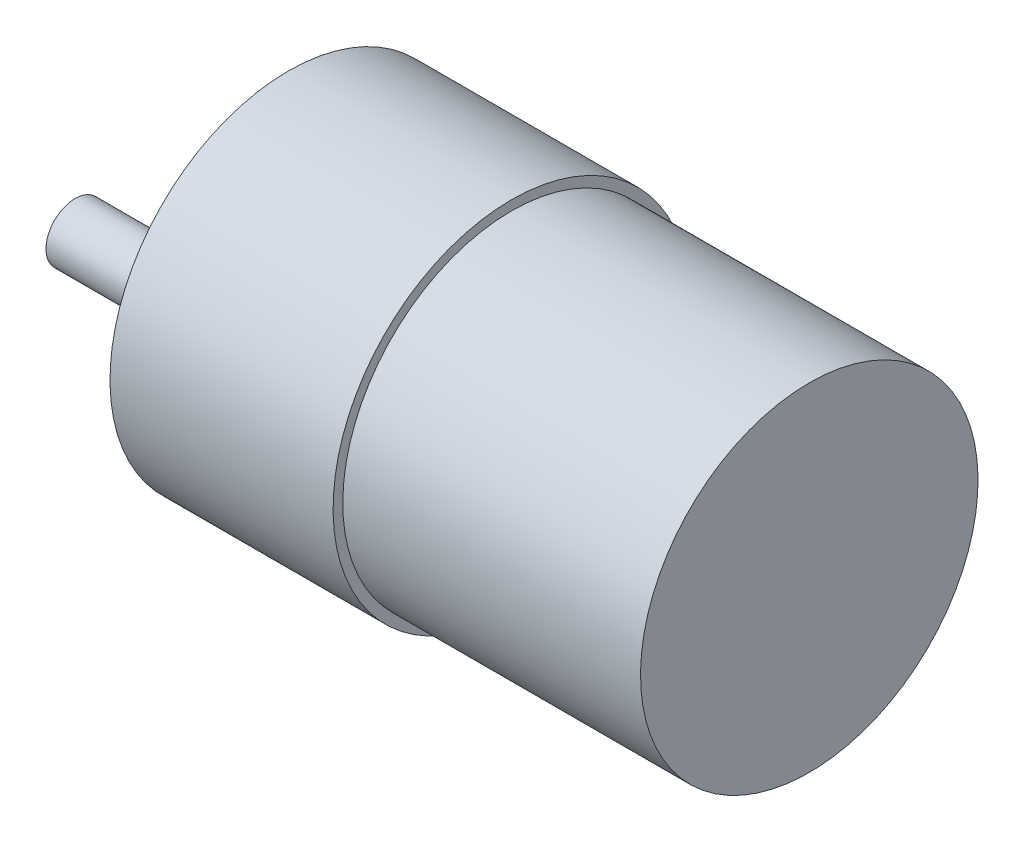
ISO-10303-21;
HEADER;
FILE_DESCRIPTION(('STEP AP214'),'2;1');
FILE_NAME('part.step','',(''),(''),'','','');
FILE_SCHEMA(('AUTOMOTIVE_DESIGN { 1 0 10303 214 1 1 1 1 }'));
ENDSEC;
DATA;
#1=APPLICATION_CONTEXT('core data for automotive mechanical design processes');
#2=APPLICATION_PROTOCOL_DEFINITION('international standard','automotive_design',2000,#1);
#3=PRODUCT_CONTEXT('',#1,'mechanical');
#4=PRODUCT('Part','Part','',(#3));
#5=PRODUCT_RELATED_PRODUCT_CATEGORY('part','',(#4));
#6=PRODUCT_DEFINITION_FORMATION('','',#4);
#7=PRODUCT_DEFINITION_CONTEXT('part definition',#1,'design');
#8=PRODUCT_DEFINITION('design','',#6,#7);
#9=PRODUCT_DEFINITION_SHAPE('','',#8);
#10=(LENGTH_UNIT() NAMED_UNIT(*) SI_UNIT(.MILLI.,.METRE.));
#11=(NAMED_UNIT(*) PLANE_ANGLE_UNIT() SI_UNIT($,.RADIAN.));
#12=(NAMED_UNIT(*) SI_UNIT($,.STERADIAN.) SOLID_ANGLE_UNIT());
#13=UNCERTAINTY_MEASURE_WITH_UNIT(LENGTH_MEASURE(1.E-05),#10,'distance_accuracy_value','');
#14=(GEOMETRIC_REPRESENTATION_CONTEXT(3) GLOBAL_UNCERTAINTY_ASSIGNED_CONTEXT((#13)) GLOBAL_UNIT_ASSIGNED_CONTEXT((#10,
#11,#12)) REPRESENTATION_CONTEXT('',''));
#15=CARTESIAN_POINT('',(0.,0.,0.));
#16=DIRECTION('',(0.,0.,1.));
#17=DIRECTION('',(1.,0.,0.));
#18=AXIS2_PLACEMENT_3D('',#15,#16,#17);
#19=CARTESIAN_POINT('',(0.,0.,0.));
#20=DIRECTION('',(-1.,0.,0.));
#21=DIRECTION('',(0.,-1.,0.));
#22=AXIS2_PLACEMENT_3D('',#19,#20,#21);
#23=PLANE('',#22);
#24=CARTESIAN_POINT('',(0.,0.,15.5));
#25=DIRECTION('',(-1.,0.,0.));
#26=DIRECTION('',(0.,-1.,0.));
#27=AXIS2_PLACEMENT_3D('',#24,#25,#26);
#28=CIRCLE('',#27,1.5);
#29=CARTESIAN_POINT('',(0.,-1.5,15.5));
#30=VERTEX_POINT('',#29);
#31=EDGE_CURVE('E112',#30,#30,#28,.T.);
#32=ORIENTED_EDGE('',*,*,#31,.F.);
#33=EDGE_LOOP('',(#32));
#34=FACE_BOUND('',#33,.T.);
#35=CARTESIAN_POINT('',(0.,13.4233937586588,7.75));
#36=DIRECTION('',(-1.,0.,0.));
#37=DIRECTION('',(0.,-1.,0.));
#38=AXIS2_PLACEMENT_3D('',#35,#36,#37);
#39=CIRCLE('',#38,1.5);
#40=CARTESIAN_POINT('',(0.,11.9233937586588,7.75));
#41=VERTEX_POINT('',#40);
#42=EDGE_CURVE('E84',#41,#41,#39,.T.);
#43=ORIENTED_EDGE('',*,*,#42,.F.);
#44=EDGE_LOOP('',(#43));
#45=FACE_BOUND('',#44,.T.);
#46=CARTESIAN_POINT('',(0.,13.4233937586588,-7.75000000000001));
#47=DIRECTION('',(-1.,0.,0.));
#48=DIRECTION('',(0.,-1.,0.));
#49=AXIS2_PLACEMENT_3D('',#46,#47,#48);
#50=CIRCLE('',#49,1.5);
#51=CARTESIAN_POINT('',(0.,11.9233937586588,-7.75000000000001));
#52=VERTEX_POINT('',#51);
#53=EDGE_CURVE('E83',#52,#52,#50,.T.);
#54=ORIENTED_EDGE('',*,*,#53,.F.);
#55=EDGE_LOOP('',(#54));
#56=FACE_BOUND('',#55,.T.);
#57=CARTESIAN_POINT('',(0.,0.,-15.5));
#58=DIRECTION('',(-1.,0.,0.));
#59=DIRECTION('',(0.,-1.,0.));
#60=AXIS2_PLACEMENT_3D('',#57,#58,#59);
#61=CIRCLE('',#60,1.5);
#62=CARTESIAN_POINT('',(0.,-1.5,-15.5));
#63=VERTEX_POINT('',#62);
#64=EDGE_CURVE('E92',#63,#63,#61,.T.);
#65=ORIENTED_EDGE('',*,*,#64,.F.);
#66=EDGE_LOOP('',(#65));
#67=FACE_BOUND('',#66,.T.);
#68=CARTESIAN_POINT('',(0.,-13.4233937586588,-7.75));
#69=DIRECTION('',(-1.,0.,0.));
#70=DIRECTION('',(0.,-1.,0.));
#71=AXIS2_PLACEMENT_3D('',#68,#69,#70);
#72=CIRCLE('',#71,1.5);
#73=CARTESIAN_POINT('',(0.,-14.9233937586588,-7.75));
#74=VERTEX_POINT('',#73);
#75=EDGE_CURVE('E100',#74,#74,#72,.T.);
#76=ORIENTED_EDGE('',*,*,#75,.F.);
#77=EDGE_LOOP('',(#76));
#78=FACE_BOUND('',#77,.T.);
#79=CARTESIAN_POINT('',(0.,-13.4233937586588,7.75));
#80=DIRECTION('',(-1.,0.,0.));
#81=DIRECTION('',(0.,-1.,0.));
#82=AXIS2_PLACEMENT_3D('',#79,#80,#81);
#83=CIRCLE('',#82,1.5);
#84=CARTESIAN_POINT('',(0.,-14.9233937586588,7.75));
#85=VERTEX_POINT('',#84);
#86=EDGE_CURVE('E108',#85,#85,#83,.T.);
#87=ORIENTED_EDGE('',*,*,#86,.F.);
#88=EDGE_LOOP('',(#87));
#89=FACE_BOUND('',#88,.T.);
#90=CARTESIAN_POINT('',(0.,-7.,0.));
#91=DIRECTION('',(-1.,0.,0.));
#92=DIRECTION('',(0.,-1.,0.));
#93=AXIS2_PLACEMENT_3D('',#90,#91,#92);
#94=CIRCLE('',#93,6.);
#95=CARTESIAN_POINT('',(0.,-13.,0.));
#96=VERTEX_POINT('',#95);
#97=EDGE_CURVE('E70',#96,#96,#94,.T.);
#98=ORIENTED_EDGE('',*,*,#97,.F.);
#99=EDGE_LOOP('',(#98));
#100=FACE_BOUND('',#99,.T.);
#101=CARTESIAN_POINT('',(0.,0.,0.));
#102=DIRECTION('',(1.,0.,0.));
#103=DIRECTION('',(0.,1.,0.));
#104=AXIS2_PLACEMENT_3D('',#101,#102,#103);
#105=CIRCLE('',#104,18.4);
#106=CARTESIAN_POINT('',(0.,18.4,0.));
#107=VERTEX_POINT('',#106);
#108=EDGE_CURVE('E10',#107,#107,#105,.T.);
#109=ORIENTED_EDGE('',*,*,#108,.F.);
#110=EDGE_LOOP('',(#109));
#111=FACE_BOUND('',#110,.T.);
#112=ADVANCED_FACE('F43',(#34,#45,#56,#67,#78,#89,#100,#111),#23,.T.);
#113=CARTESIAN_POINT('',(53.7,0.,0.));
#114=DIRECTION('',(1.,0.,0.));
#115=DIRECTION('',(0.,1.,0.));
#116=AXIS2_PLACEMENT_3D('',#113,#114,#115);
#117=CYLINDRICAL_SURFACE('',#116,18.4);
#118=ORIENTED_EDGE('',*,*,#108,.T.);
#119=EDGE_LOOP('',(#118));
#120=FACE_BOUND('',#119,.T.);
#121=CARTESIAN_POINT('',(23.,0.,0.));
#122=DIRECTION('',(1.,0.,0.));
#123=DIRECTION('',(0.,1.,0.));
#124=AXIS2_PLACEMENT_3D('',#121,#122,#123);
#125=CIRCLE('',#124,18.4);
#126=CARTESIAN_POINT('',(23.,18.4,0.));
#127=VERTEX_POINT('',#126);
#128=EDGE_CURVE('E51',#127,#127,#125,.T.);
#129=ORIENTED_EDGE('',*,*,#128,.F.);
#130=EDGE_LOOP('',(#129));
#131=FACE_BOUND('',#130,.T.);
#132=ADVANCED_FACE('F138',(#120,#131),#117,.T.);
#133=CARTESIAN_POINT('',(23.,18.4,0.));
#134=DIRECTION('',(1.,0.,0.));
#135=DIRECTION('',(0.,1.,0.));
#136=AXIS2_PLACEMENT_3D('',#133,#134,#135);
#137=PLANE('',#136);
#138=ORIENTED_EDGE('',*,*,#128,.T.);
#139=EDGE_LOOP('',(#138));
#140=FACE_BOUND('',#139,.T.);
#141=CARTESIAN_POINT('',(23.,0.,0.));
#142=DIRECTION('',(1.,0.,0.));
#143=DIRECTION('',(0.,1.,0.));
#144=AXIS2_PLACEMENT_3D('',#141,#142,#143);
#145=CIRCLE('',#144,17.4);
#146=CARTESIAN_POINT('',(23.,17.4,0.));
#147=VERTEX_POINT('',#146);
#148=EDGE_CURVE('E56',#147,#147,#145,.T.);
#149=ORIENTED_EDGE('',*,*,#148,.F.);
#150=EDGE_LOOP('',(#149));
#151=FACE_BOUND('',#150,.T.);
#152=ADVANCED_FACE('F181',(#140,#151),#137,.T.);
#153=CARTESIAN_POINT('',(53.7,0.,0.));
#154=DIRECTION('',(1.,0.,0.));
#155=DIRECTION('',(0.,1.,0.));
#156=AXIS2_PLACEMENT_3D('',#153,#154,#155);
#157=CYLINDRICAL_SURFACE('',#156,17.4);
#158=ORIENTED_EDGE('',*,*,#148,.T.);
#159=EDGE_LOOP('',(#158));
#160=FACE_BOUND('',#159,.T.);
#161=CARTESIAN_POINT('',(53.7,0.,0.));
#162=DIRECTION('',(1.,0.,0.));
#163=DIRECTION('',(0.,1.,0.));
#164=AXIS2_PLACEMENT_3D('',#161,#162,#163);
#165=CIRCLE('',#164,17.4);
#166=CARTESIAN_POINT('',(53.7,17.4,0.));
#167=VERTEX_POINT('',#166);
#168=EDGE_CURVE('E62',#167,#167,#165,.T.);
#169=ORIENTED_EDGE('',*,*,#168,.F.);
#170=EDGE_LOOP('',(#169));
#171=FACE_BOUND('',#170,.T.);
#172=ADVANCED_FACE('F166',(#160,#171),#157,.T.);
#173=CARTESIAN_POINT('',(53.7,17.4,0.));
#174=DIRECTION('',(1.,0.,0.));
#175=DIRECTION('',(0.,1.,0.));
#176=AXIS2_PLACEMENT_3D('',#173,#174,#175);
#177=PLANE('',#176);
#178=ORIENTED_EDGE('',*,*,#168,.T.);
#179=EDGE_LOOP('',(#178));
#180=FACE_BOUND('',#179,.T.);
#181=ADVANCED_FACE('F155',(#180),#177,.T.);
#182=CARTESIAN_POINT('',(-6.,-7.,0.));
#183=DIRECTION('',(1.,0.,0.));
#184=DIRECTION('',(0.,1.,0.));
#185=AXIS2_PLACEMENT_3D('',#182,#183,#184);
#186=CYLINDRICAL_SURFACE('',#185,6.);
#187=CARTESIAN_POINT('',(-6.,-7.,0.));
#188=DIRECTION('',(-1.,0.,0.));
#189=DIRECTION('',(0.,-1.,0.));
#190=AXIS2_PLACEMENT_3D('',#187,#188,#189);
#191=CIRCLE('',#190,6.);
#192=CARTESIAN_POINT('',(-6.,-13.,0.));
#193=VERTEX_POINT('',#192);
#194=EDGE_CURVE('E74',#193,#193,#191,.T.);
#195=ORIENTED_EDGE('',*,*,#194,.F.);
#196=EDGE_LOOP('',(#195));
#197=FACE_BOUND('',#196,.T.);
#198=ORIENTED_EDGE('',*,*,#97,.T.);
#199=EDGE_LOOP('',(#198));
#200=FACE_BOUND('',#199,.T.);
#201=ADVANCED_FACE('F152',(#197,#200),#186,.T.);
#202=CARTESIAN_POINT('',(-6.,-7.,0.));
#203=DIRECTION('',(-1.,0.,0.));
#204=DIRECTION('',(0.,-1.,0.));
#205=AXIS2_PLACEMENT_3D('',#202,#203,#204);
#206=PLANE('',#205);
#207=CARTESIAN_POINT('',(-6.,-7.,0.));
#208=DIRECTION('',(-1.,0.,0.));
#209=DIRECTION('',(0.,-1.,0.));
#210=AXIS2_PLACEMENT_3D('',#207,#208,#209);
#211=CIRCLE('',#210,3.);
#212=CARTESIAN_POINT('',(-6.,-10.,0.));
#213=VERTEX_POINT('',#212);
#214=EDGE_CURVE('E46',#213,#213,#211,.T.);
#215=ORIENTED_EDGE('',*,*,#214,.F.);
#216=EDGE_LOOP('',(#215));
#217=FACE_BOUND('',#216,.T.);
#218=ORIENTED_EDGE('',*,*,#194,.T.);
#219=EDGE_LOOP('',(#218));
#220=FACE_BOUND('',#219,.T.);
#221=ADVANCED_FACE('F154',(#217,#220),#206,.T.);
#222=CARTESIAN_POINT('',(-22.,-7.,0.));
#223=DIRECTION('',(-1.,0.,0.));
#224=DIRECTION('',(0.,-1.,0.));
#225=AXIS2_PLACEMENT_3D('',#222,#223,#224);
#226=PLANE('',#225);
#227=CARTESIAN_POINT('',(-22.,-7.,0.));
#228=DIRECTION('',(-1.,0.,0.));
#229=DIRECTION('',(0.,-1.,0.));
#230=AXIS2_PLACEMENT_3D('',#227,#228,#229);
#231=CIRCLE('',#230,3.);
#232=CARTESIAN_POINT('',(-22.,-10.,0.));
#233=VERTEX_POINT('',#232);
#234=EDGE_CURVE('E66',#233,#233,#231,.T.);
#235=ORIENTED_EDGE('',*,*,#234,.T.);
#236=EDGE_LOOP('',(#235));
#237=FACE_BOUND('',#236,.T.);
#238=ADVANCED_FACE('F162',(#237),#226,.T.);
#239=CARTESIAN_POINT('',(-22.,-7.,0.));
#240=DIRECTION('',(1.,0.,0.));
#241=DIRECTION('',(0.,1.,0.));
#242=AXIS2_PLACEMENT_3D('',#239,#240,#241);
#243=CYLINDRICAL_SURFACE('',#242,3.);
#244=ORIENTED_EDGE('',*,*,#214,.T.);
#245=EDGE_LOOP('',(#244));
#246=FACE_BOUND('',#245,.T.);
#247=ORIENTED_EDGE('',*,*,#234,.F.);
#248=EDGE_LOOP('',(#247));
#249=FACE_BOUND('',#248,.T.);
#250=ADVANCED_FACE('F173',(#246,#249),#243,.T.);
#251=CARTESIAN_POINT('',(6.,-13.4233937586588,7.75));
#252=DIRECTION('',(-1.,0.,0.));
#253=DIRECTION('',(0.,-1.,0.));
#254=AXIS2_PLACEMENT_3D('',#251,#252,#253);
#255=CYLINDRICAL_SURFACE('',#254,1.5);
#256=CARTESIAN_POINT('',(6.,-13.4233937586588,7.75));
#257=DIRECTION('',(-1.,0.,0.));
#258=DIRECTION('',(0.,-1.,0.));
#259=AXIS2_PLACEMENT_3D('',#256,#257,#258);
#260=CIRCLE('',#259,1.5);
#261=CARTESIAN_POINT('',(6.,-14.9233937586588,7.75));
#262=VERTEX_POINT('',#261);
#263=EDGE_CURVE('E104',#262,#262,#260,.T.);
#264=ORIENTED_EDGE('',*,*,#263,.F.);
#265=EDGE_LOOP('',(#264));
#266=FACE_BOUND('',#265,.T.);
#267=ORIENTED_EDGE('',*,*,#86,.T.);
#268=EDGE_LOOP('',(#267));
#269=FACE_BOUND('',#268,.T.);
#270=ADVANCED_FACE('F176',(#266,#269),#255,.F.);
#271=CARTESIAN_POINT('',(6.,-13.4233937586588,7.75));
#272=DIRECTION('',(-1.,0.,0.));
#273=DIRECTION('',(0.,-1.,0.));
#274=AXIS2_PLACEMENT_3D('',#271,#272,#273);
#275=PLANE('',#274);
#276=ORIENTED_EDGE('',*,*,#263,.T.);
#277=EDGE_LOOP('',(#276));
#278=FACE_BOUND('',#277,.T.);
#279=ADVANCED_FACE('F239',(#278),#275,.T.);
#280=CARTESIAN_POINT('',(6.,-13.4233937586588,-7.75));
#281=DIRECTION('',(-1.,0.,0.));
#282=DIRECTION('',(0.,-1.,0.));
#283=AXIS2_PLACEMENT_3D('',#280,#281,#282);
#284=CYLINDRICAL_SURFACE('',#283,1.5);
#285=CARTESIAN_POINT('',(6.,-13.4233937586588,-7.75));
#286=DIRECTION('',(-1.,0.,0.));
#287=DIRECTION('',(0.,-1.,0.));
#288=AXIS2_PLACEMENT_3D('',#285,#286,#287);
#289=CIRCLE('',#288,1.5);
#290=CARTESIAN_POINT('',(6.,-14.9233937586588,-7.75));
#291=VERTEX_POINT('',#290);
#292=EDGE_CURVE('E96',#291,#291,#289,.T.);
#293=ORIENTED_EDGE('',*,*,#292,.F.);
#294=EDGE_LOOP('',(#293));
#295=FACE_BOUND('',#294,.T.);
#296=ORIENTED_EDGE('',*,*,#75,.T.);
#297=EDGE_LOOP('',(#296));
#298=FACE_BOUND('',#297,.T.);
#299=ADVANCED_FACE('F249',(#295,#298),#284,.F.);
#300=CARTESIAN_POINT('',(6.,-13.4233937586588,-7.75));
#301=DIRECTION('',(-1.,0.,0.));
#302=DIRECTION('',(0.,-1.,0.));
#303=AXIS2_PLACEMENT_3D('',#300,#301,#302);
#304=PLANE('',#303);
#305=ORIENTED_EDGE('',*,*,#292,.T.);
#306=EDGE_LOOP('',(#305));
#307=FACE_BOUND('',#306,.T.);
#308=ADVANCED_FACE('F259',(#307),#304,.T.);
#309=CARTESIAN_POINT('',(6.,0.,-15.5));
#310=DIRECTION('',(-1.,0.,0.));
#311=DIRECTION('',(0.,-1.,0.));
#312=AXIS2_PLACEMENT_3D('',#309,#310,#311);
#313=CYLINDRICAL_SURFACE('',#312,1.5);
#314=CARTESIAN_POINT('',(6.,0.,-15.5));
#315=DIRECTION('',(-1.,0.,0.));
#316=DIRECTION('',(0.,-1.,0.));
#317=AXIS2_PLACEMENT_3D('',#314,#315,#316);
#318=CIRCLE('',#317,1.5);
#319=CARTESIAN_POINT('',(6.,-1.5,-15.5));
#320=VERTEX_POINT('',#319);
#321=EDGE_CURVE('E88',#320,#320,#318,.T.);
#322=ORIENTED_EDGE('',*,*,#321,.F.);
#323=EDGE_LOOP('',(#322));
#324=FACE_BOUND('',#323,.T.);
#325=ORIENTED_EDGE('',*,*,#64,.T.);
#326=EDGE_LOOP('',(#325));
#327=FACE_BOUND('',#326,.T.);
#328=ADVANCED_FACE('F269',(#324,#327),#313,.F.);
#329=CARTESIAN_POINT('',(6.,0.,-15.5));
#330=DIRECTION('',(-1.,0.,0.));
#331=DIRECTION('',(0.,-1.,0.));
#332=AXIS2_PLACEMENT_3D('',#329,#330,#331);
#333=PLANE('',#332);
#334=ORIENTED_EDGE('',*,*,#321,.T.);
#335=EDGE_LOOP('',(#334));
#336=FACE_BOUND('',#335,.T.);
#337=ADVANCED_FACE('F279',(#336),#333,.T.);
#338=CARTESIAN_POINT('',(6.,13.4233937586588,-7.75000000000001));
#339=DIRECTION('',(-1.,0.,0.));
#340=DIRECTION('',(0.,-1.,0.));
#341=AXIS2_PLACEMENT_3D('',#338,#339,#340);
#342=CYLINDRICAL_SURFACE('',#341,1.5);
#343=CARTESIAN_POINT('',(6.,13.4233937586588,-7.75000000000001));
#344=DIRECTION('',(-1.,0.,0.));
#345=DIRECTION('',(0.,-1.,0.));
#346=AXIS2_PLACEMENT_3D('',#343,#344,#345);
#347=CIRCLE('',#346,1.5);
#348=CARTESIAN_POINT('',(6.,11.9233937586588,-7.75000000000001));
#349=VERTEX_POINT('',#348);
#350=EDGE_CURVE('E79',#349,#349,#347,.T.);
#351=ORIENTED_EDGE('',*,*,#350,.F.);
#352=EDGE_LOOP('',(#351));
#353=FACE_BOUND('',#352,.T.);
#354=ORIENTED_EDGE('',*,*,#53,.T.);
#355=EDGE_LOOP('',(#354));
#356=FACE_BOUND('',#355,.T.);
#357=ADVANCED_FACE('F289',(#353,#356),#342,.F.);
#358=CARTESIAN_POINT('',(6.,13.4233937586588,-7.75000000000001));
#359=DIRECTION('',(-1.,0.,0.));
#360=DIRECTION('',(0.,-1.,0.));
#361=AXIS2_PLACEMENT_3D('',#358,#359,#360);
#362=PLANE('',#361);
#363=ORIENTED_EDGE('',*,*,#350,.T.);
#364=EDGE_LOOP('',(#363));
#365=FACE_BOUND('',#364,.T.);
#366=ADVANCED_FACE('F299',(#365),#362,.T.);
#367=CARTESIAN_POINT('',(6.,13.4233937586588,7.75));
#368=DIRECTION('',(-1.,0.,0.));
#369=DIRECTION('',(0.,-1.,0.));
#370=AXIS2_PLACEMENT_3D('',#367,#368,#369);
#371=CYLINDRICAL_SURFACE('',#370,1.5);
#372=CARTESIAN_POINT('',(6.,13.4233937586588,7.75));
#373=DIRECTION('',(-1.,0.,0.));
#374=DIRECTION('',(0.,-1.,0.));
#375=AXIS2_PLACEMENT_3D('',#372,#373,#374);
#376=CIRCLE('',#375,1.5);
#377=CARTESIAN_POINT('',(6.,11.9233937586588,7.75));
#378=VERTEX_POINT('',#377);
#379=EDGE_CURVE('E113',#378,#378,#376,.T.);
#380=ORIENTED_EDGE('',*,*,#379,.F.);
#381=EDGE_LOOP('',(#380));
#382=FACE_BOUND('',#381,.T.);
#383=ORIENTED_EDGE('',*,*,#42,.T.);
#384=EDGE_LOOP('',(#383));
#385=FACE_BOUND('',#384,.T.);
#386=ADVANCED_FACE('F309',(#382,#385),#371,.F.);
#387=CARTESIAN_POINT('',(6.,13.4233937586588,7.75));
#388=DIRECTION('',(-1.,0.,0.));
#389=DIRECTION('',(0.,-1.,0.));
#390=AXIS2_PLACEMENT_3D('',#387,#388,#389);
#391=PLANE('',#390);
#392=ORIENTED_EDGE('',*,*,#379,.T.);
#393=EDGE_LOOP('',(#392));
#394=FACE_BOUND('',#393,.T.);
#395=ADVANCED_FACE('F132',(#394),#391,.T.);
#396=CARTESIAN_POINT('',(6.,0.,15.5));
#397=DIRECTION('',(-1.,0.,0.));
#398=DIRECTION('',(0.,-1.,0.));
#399=AXIS2_PLACEMENT_3D('',#396,#397,#398);
#400=CYLINDRICAL_SURFACE('',#399,1.5);
#401=CARTESIAN_POINT('',(6.,0.,15.5));
#402=DIRECTION('',(-1.,0.,0.));
#403=DIRECTION('',(0.,-1.,0.));
#404=AXIS2_PLACEMENT_3D('',#401,#402,#403);
#405=CIRCLE('',#404,1.5);
#406=CARTESIAN_POINT('',(6.,-1.5,15.5));
#407=VERTEX_POINT('',#406);
#408=EDGE_CURVE('E75',#407,#407,#405,.T.);
#409=ORIENTED_EDGE('',*,*,#408,.F.);
#410=EDGE_LOOP('',(#409));
#411=FACE_BOUND('',#410,.T.);
#412=ORIENTED_EDGE('',*,*,#31,.T.);
#413=EDGE_LOOP('',(#412));
#414=FACE_BOUND('',#413,.T.);
#415=ADVANCED_FACE('F129',(#411,#414),#400,.F.);
#416=CARTESIAN_POINT('',(6.,0.,15.5));
#417=DIRECTION('',(-1.,0.,0.));
#418=DIRECTION('',(0.,-1.,0.));
#419=AXIS2_PLACEMENT_3D('',#416,#417,#418);
#420=PLANE('',#419);
#421=ORIENTED_EDGE('',*,*,#408,.T.);
#422=EDGE_LOOP('',(#421));
#423=FACE_BOUND('',#422,.T.);
#424=ADVANCED_FACE('F127',(#423),#420,.T.);
#425=CLOSED_SHELL('',(#112,#132,#152,#172,#181,#201,#221,#238,#250,#270,#279,#299,#308,#328,
#337,#357,#366,#386,#395,#415,#424));
#426=MANIFOLD_SOLID_BREP('B2',#425);
#427=ADVANCED_BREP_SHAPE_REPRESENTATION('',(#18,#426),#14);
#428=SHAPE_DEFINITION_REPRESENTATION(#9,#427);
ENDSEC;
END-ISO-10303-21;
